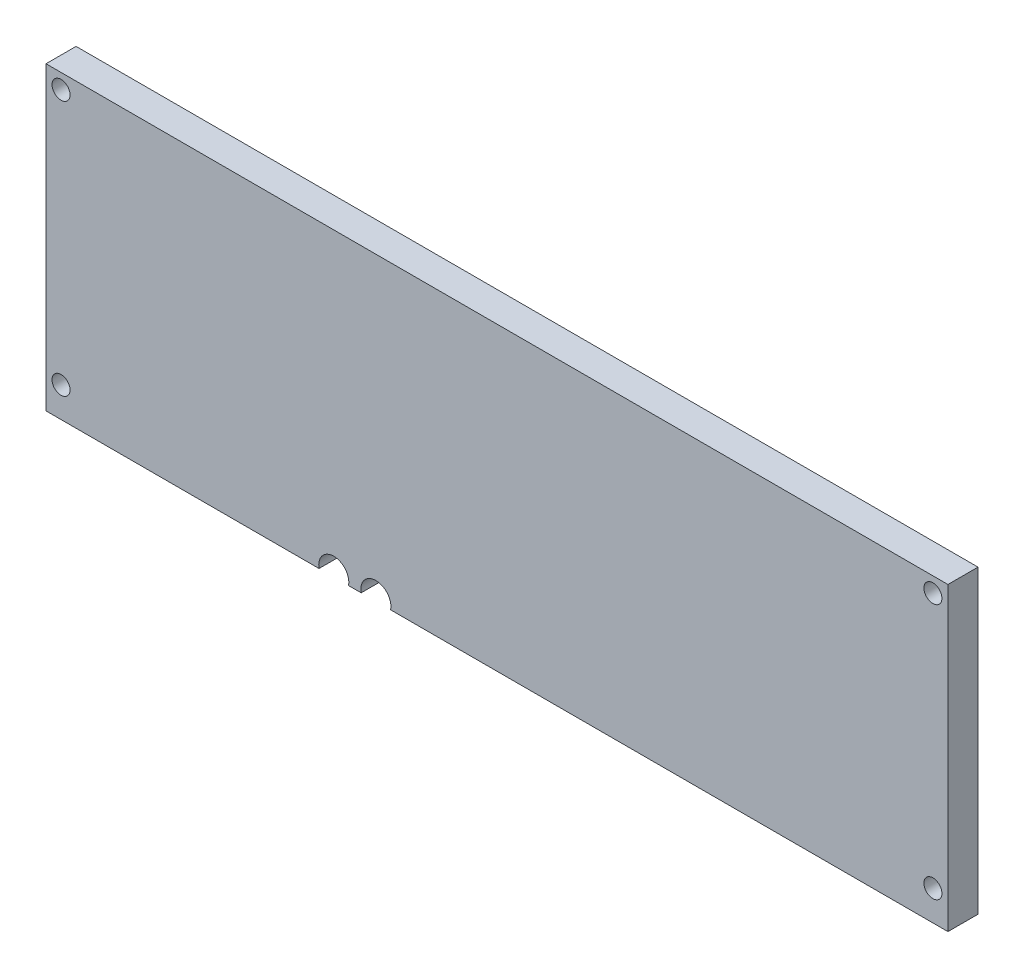
ISO-10303-21;
HEADER;
FILE_DESCRIPTION(('STEP AP214'),'2;1');
FILE_NAME('part.step','',(''),(''),'','','');
FILE_SCHEMA(('AUTOMOTIVE_DESIGN { 1 0 10303 214 1 1 1 1 }'));
ENDSEC;
DATA;
#1=APPLICATION_CONTEXT('core data for automotive mechanical design processes');
#2=APPLICATION_PROTOCOL_DEFINITION('international standard','automotive_design',2000,#1);
#3=PRODUCT_CONTEXT('',#1,'mechanical');
#4=PRODUCT('Part','Part','',(#3));
#5=PRODUCT_RELATED_PRODUCT_CATEGORY('part','',(#4));
#6=PRODUCT_DEFINITION_FORMATION('','',#4);
#7=PRODUCT_DEFINITION_CONTEXT('part definition',#1,'design');
#8=PRODUCT_DEFINITION('design','',#6,#7);
#9=PRODUCT_DEFINITION_SHAPE('','',#8);
#10=(LENGTH_UNIT() NAMED_UNIT(*) SI_UNIT(.MILLI.,.METRE.));
#11=(NAMED_UNIT(*) PLANE_ANGLE_UNIT() SI_UNIT($,.RADIAN.));
#12=(NAMED_UNIT(*) SI_UNIT($,.STERADIAN.) SOLID_ANGLE_UNIT());
#13=UNCERTAINTY_MEASURE_WITH_UNIT(LENGTH_MEASURE(1.E-05),#10,'distance_accuracy_value','');
#14=(GEOMETRIC_REPRESENTATION_CONTEXT(3) GLOBAL_UNCERTAINTY_ASSIGNED_CONTEXT((#13)) GLOBAL_UNIT_ASSIGNED_CONTEXT((#10,
#11,#12)) REPRESENTATION_CONTEXT('',''));
#15=CARTESIAN_POINT('',(0.,0.,0.));
#16=DIRECTION('',(0.,0.,1.));
#17=DIRECTION('',(1.,0.,0.));
#18=AXIS2_PLACEMENT_3D('',#15,#16,#17);
#19=CARTESIAN_POINT('',(0.,0.,5.));
#20=DIRECTION('',(0.,1.,0.));
#21=DIRECTION('',(0.,0.,1.));
#22=AXIS2_PLACEMENT_3D('',#19,#20,#21);
#23=PLANE('',#22);
#24=DIRECTION('',(1.,0.,0.));
#25=VECTOR('',#24,1.);
#26=CARTESIAN_POINT('',(0.,0.,5.));
#27=LINE('',#26,#25);
#28=CARTESIAN_POINT('',(57.310128062905,0.,5.));
#29=VERTEX_POINT('',#28);
#30=CARTESIAN_POINT('',(150.,0.,5.));
#31=VERTEX_POINT('',#30);
#32=EDGE_CURVE('E125',#29,#31,#27,.T.);
#33=ORIENTED_EDGE('',*,*,#32,.F.);
#34=DIRECTION('',(0.,0.,-1.));
#35=VECTOR('',#34,1.);
#36=CARTESIAN_POINT('',(57.310128062905,0.,5.));
#37=LINE('',#36,#35);
#38=CARTESIAN_POINT('',(57.310128062905,0.,0.));
#39=VERTEX_POINT('',#38);
#40=EDGE_CURVE('E223',#29,#39,#37,.T.);
#41=ORIENTED_EDGE('',*,*,#40,.T.);
#42=DIRECTION('',(1.,0.,0.));
#43=VECTOR('',#42,1.);
#44=CARTESIAN_POINT('',(0.,0.,0.));
#45=LINE('',#44,#43);
#46=CARTESIAN_POINT('',(150.,0.,0.));
#47=VERTEX_POINT('',#46);
#48=EDGE_CURVE('E144',#39,#47,#45,.T.);
#49=ORIENTED_EDGE('',*,*,#48,.T.);
#50=DIRECTION('',(0.,0.,-1.));
#51=VECTOR('',#50,1.);
#52=CARTESIAN_POINT('',(150.,0.,5.));
#53=LINE('',#52,#51);
#54=EDGE_CURVE('E164',#31,#47,#53,.T.);
#55=ORIENTED_EDGE('',*,*,#54,.F.);
#56=EDGE_LOOP('',(#33,#41,#49,#55));
#57=FACE_BOUND('',#56,.T.);
#58=ADVANCED_FACE('F39',(#57),#23,.F.);
#59=CARTESIAN_POINT('',(50.3071842271044,0.,0.));
#60=VERTEX_POINT('',#59);
#61=CARTESIAN_POINT('',(52.4111485773386,0.,0.));
#62=VERTEX_POINT('',#61);
#63=EDGE_CURVE('E151',#60,#62,#45,.T.);
#64=ORIENTED_EDGE('',*,*,#63,.T.);
#65=DIRECTION('',(0.,0.,-1.));
#66=VECTOR('',#65,1.);
#67=CARTESIAN_POINT('',(52.4111485773386,0.,5.));
#68=LINE('',#67,#66);
#69=CARTESIAN_POINT('',(52.4111485773386,0.,5.));
#70=VERTEX_POINT('',#69);
#71=EDGE_CURVE('E54',#62,#70,#68,.F.);
#72=ORIENTED_EDGE('',*,*,#71,.T.);
#73=CARTESIAN_POINT('',(50.3071842271044,0.,5.));
#74=VERTEX_POINT('',#73);
#75=EDGE_CURVE('E117',#74,#70,#27,.T.);
#76=ORIENTED_EDGE('',*,*,#75,.F.);
#77=DIRECTION('',(0.,0.,-1.));
#78=VECTOR('',#77,1.);
#79=CARTESIAN_POINT('',(50.3071842271044,0.,5.));
#80=LINE('',#79,#78);
#81=EDGE_CURVE('E102',#74,#60,#80,.T.);
#82=ORIENTED_EDGE('',*,*,#81,.T.);
#83=EDGE_LOOP('',(#64,#72,#76,#82));
#84=FACE_BOUND('',#83,.T.);
#85=ADVANCED_FACE('F123',(#84),#23,.F.);
#86=CARTESIAN_POINT('',(0.,0.,5.));
#87=DIRECTION('',(1.,0.,0.));
#88=DIRECTION('',(0.,0.,-1.));
#89=AXIS2_PLACEMENT_3D('',#86,#87,#88);
#90=PLANE('',#89);
#91=DIRECTION('',(0.,-1.,0.));
#92=VECTOR('',#91,1.);
#93=CARTESIAN_POINT('',(0.,0.,0.));
#94=LINE('',#93,#92);
#95=CARTESIAN_POINT('',(0.,50.,0.));
#96=VERTEX_POINT('',#95);
#97=CARTESIAN_POINT('',(0.,0.,0.));
#98=VERTEX_POINT('',#97);
#99=EDGE_CURVE('E140',#96,#98,#94,.T.);
#100=ORIENTED_EDGE('',*,*,#99,.T.);
#101=DIRECTION('',(0.,0.,-1.));
#102=VECTOR('',#101,1.);
#103=CARTESIAN_POINT('',(0.,0.,5.));
#104=LINE('',#103,#102);
#105=CARTESIAN_POINT('',(0.,0.,5.));
#106=VERTEX_POINT('',#105);
#107=EDGE_CURVE('E168',#106,#98,#104,.T.);
#108=ORIENTED_EDGE('',*,*,#107,.F.);
#109=DIRECTION('',(0.,-1.,0.));
#110=VECTOR('',#109,1.);
#111=CARTESIAN_POINT('',(0.,0.,5.));
#112=LINE('',#111,#110);
#113=CARTESIAN_POINT('',(0.,50.,5.));
#114=VERTEX_POINT('',#113);
#115=EDGE_CURVE('E130',#114,#106,#112,.T.);
#116=ORIENTED_EDGE('',*,*,#115,.F.);
#117=DIRECTION('',(0.,0.,-1.));
#118=VECTOR('',#117,1.);
#119=CARTESIAN_POINT('',(0.,50.,5.));
#120=LINE('',#119,#118);
#121=EDGE_CURVE('E139',#114,#96,#120,.T.);
#122=ORIENTED_EDGE('',*,*,#121,.T.);
#123=EDGE_LOOP('',(#100,#108,#116,#122));
#124=FACE_BOUND('',#123,.T.);
#125=ADVANCED_FACE('F41',(#124),#90,.F.);
#126=CARTESIAN_POINT('',(45.408204741538,0.,0.));
#127=VERTEX_POINT('',#126);
#128=EDGE_CURVE('E146',#98,#127,#45,.T.);
#129=ORIENTED_EDGE('',*,*,#128,.T.);
#130=DIRECTION('',(0.,0.,-1.));
#131=VECTOR('',#130,1.);
#132=CARTESIAN_POINT('',(45.408204741538,0.,5.));
#133=LINE('',#132,#131);
#134=CARTESIAN_POINT('',(45.408204741538,0.,5.));
#135=VERTEX_POINT('',#134);
#136=EDGE_CURVE('E62',#127,#135,#133,.F.);
#137=ORIENTED_EDGE('',*,*,#136,.T.);
#138=EDGE_CURVE('E119',#106,#135,#27,.T.);
#139=ORIENTED_EDGE('',*,*,#138,.F.);
#140=ORIENTED_EDGE('',*,*,#107,.T.);
#141=EDGE_LOOP('',(#129,#137,#139,#140));
#142=FACE_BOUND('',#141,.T.);
#143=ADVANCED_FACE('F264',(#142),#23,.F.);
#144=CARTESIAN_POINT('',(150.,0.,5.));
#145=DIRECTION('',(-1.,0.,0.));
#146=DIRECTION('',(0.,0.,1.));
#147=AXIS2_PLACEMENT_3D('',#144,#145,#146);
#148=PLANE('',#147);
#149=DIRECTION('',(0.,1.,0.));
#150=VECTOR('',#149,1.);
#151=CARTESIAN_POINT('',(150.,0.,0.));
#152=LINE('',#151,#150);
#153=CARTESIAN_POINT('',(150.,50.,0.));
#154=VERTEX_POINT('',#153);
#155=EDGE_CURVE('E150',#47,#154,#152,.T.);
#156=ORIENTED_EDGE('',*,*,#155,.T.);
#157=DIRECTION('',(0.,0.,-1.));
#158=VECTOR('',#157,1.);
#159=CARTESIAN_POINT('',(150.,50.,5.));
#160=LINE('',#159,#158);
#161=CARTESIAN_POINT('',(150.,50.,5.));
#162=VERTEX_POINT('',#161);
#163=EDGE_CURVE('E160',#162,#154,#160,.T.);
#164=ORIENTED_EDGE('',*,*,#163,.F.);
#165=DIRECTION('',(0.,1.,0.));
#166=VECTOR('',#165,1.);
#167=CARTESIAN_POINT('',(150.,0.,5.));
#168=LINE('',#167,#166);
#169=EDGE_CURVE('E129',#31,#162,#168,.T.);
#170=ORIENTED_EDGE('',*,*,#169,.F.);
#171=ORIENTED_EDGE('',*,*,#54,.T.);
#172=EDGE_LOOP('',(#156,#164,#170,#171));
#173=FACE_BOUND('',#172,.T.);
#174=ADVANCED_FACE('F243',(#173),#148,.F.);
#175=CARTESIAN_POINT('',(0.,50.,5.));
#176=DIRECTION('',(0.,-1.,0.));
#177=DIRECTION('',(0.,0.,-1.));
#178=AXIS2_PLACEMENT_3D('',#175,#176,#177);
#179=PLANE('',#178);
#180=DIRECTION('',(-1.,0.,0.));
#181=VECTOR('',#180,1.);
#182=CARTESIAN_POINT('',(0.,50.,0.));
#183=LINE('',#182,#181);
#184=EDGE_CURVE('E154',#154,#96,#183,.T.);
#185=ORIENTED_EDGE('',*,*,#184,.T.);
#186=ORIENTED_EDGE('',*,*,#121,.F.);
#187=DIRECTION('',(-1.,0.,0.));
#188=VECTOR('',#187,1.);
#189=CARTESIAN_POINT('',(0.,50.,5.));
#190=LINE('',#189,#188);
#191=EDGE_CURVE('E136',#162,#114,#190,.T.);
#192=ORIENTED_EDGE('',*,*,#191,.F.);
#193=ORIENTED_EDGE('',*,*,#163,.T.);
#194=EDGE_LOOP('',(#185,#186,#192,#193));
#195=FACE_BOUND('',#194,.T.);
#196=ADVANCED_FACE('F249',(#195),#179,.F.);
#197=CARTESIAN_POINT('',(0.,0.,5.));
#198=DIRECTION('',(0.,0.,-1.));
#199=DIRECTION('',(-1.,0.,0.));
#200=AXIS2_PLACEMENT_3D('',#197,#198,#199);
#201=PLANE('',#200);
#202=CARTESIAN_POINT('',(147.5,5.,5.));
#203=DIRECTION('',(0.,0.,1.));
#204=DIRECTION('',(1.,0.,0.));
#205=AXIS2_PLACEMENT_3D('',#202,#203,#204);
#206=CIRCLE('',#205,1.5);
#207=CARTESIAN_POINT('',(149.,5.,5.));
#208=VERTEX_POINT('',#207);
#209=EDGE_CURVE('E219',#208,#208,#206,.T.);
#210=ORIENTED_EDGE('',*,*,#209,.F.);
#211=EDGE_LOOP('',(#210));
#212=FACE_BOUND('',#211,.T.);
#213=CARTESIAN_POINT('',(147.5,47.5,5.));
#214=DIRECTION('',(0.,0.,1.));
#215=DIRECTION('',(1.,0.,0.));
#216=AXIS2_PLACEMENT_3D('',#213,#214,#215);
#217=CIRCLE('',#216,1.5);
#218=CARTESIAN_POINT('',(149.,47.5,5.));
#219=VERTEX_POINT('',#218);
#220=EDGE_CURVE('E216',#219,#219,#217,.T.);
#221=ORIENTED_EDGE('',*,*,#220,.F.);
#222=EDGE_LOOP('',(#221));
#223=FACE_BOUND('',#222,.T.);
#224=CARTESIAN_POINT('',(2.5,47.5,5.));
#225=DIRECTION('',(0.,0.,1.));
#226=DIRECTION('',(1.,0.,0.));
#227=AXIS2_PLACEMENT_3D('',#224,#225,#226);
#228=CIRCLE('',#227,1.5);
#229=CARTESIAN_POINT('',(4.,47.5,5.));
#230=VERTEX_POINT('',#229);
#231=EDGE_CURVE('E213',#230,#230,#228,.T.);
#232=ORIENTED_EDGE('',*,*,#231,.F.);
#233=EDGE_LOOP('',(#232));
#234=FACE_BOUND('',#233,.T.);
#235=CARTESIAN_POINT('',(2.5,5.,5.));
#236=DIRECTION('',(0.,0.,1.));
#237=DIRECTION('',(1.,0.,0.));
#238=AXIS2_PLACEMENT_3D('',#235,#236,#237);
#239=CIRCLE('',#238,1.5);
#240=CARTESIAN_POINT('',(4.,5.,5.));
#241=VERTEX_POINT('',#240);
#242=EDGE_CURVE('E177',#241,#241,#239,.T.);
#243=ORIENTED_EDGE('',*,*,#242,.F.);
#244=EDGE_LOOP('',(#243));
#245=FACE_BOUND('',#244,.T.);
#246=ORIENTED_EDGE('',*,*,#75,.T.);
#247=CARTESIAN_POINT('',(54.8606383201218,0.5,5.));
#248=DIRECTION('',(0.,0.,-1.));
#249=DIRECTION('',(-1.,0.,0.));
#250=AXIS2_PLACEMENT_3D('',#247,#248,#249);
#251=CIRCLE('',#250,2.5);
#252=EDGE_CURVE('E121',#70,#29,#251,.T.);
#253=ORIENTED_EDGE('',*,*,#252,.T.);
#254=ORIENTED_EDGE('',*,*,#32,.T.);
#255=ORIENTED_EDGE('',*,*,#169,.T.);
#256=ORIENTED_EDGE('',*,*,#191,.T.);
#257=ORIENTED_EDGE('',*,*,#115,.T.);
#258=ORIENTED_EDGE('',*,*,#138,.T.);
#259=CARTESIAN_POINT('',(47.8576944843212,0.5,5.));
#260=DIRECTION('',(0.,0.,-1.));
#261=DIRECTION('',(-1.,0.,0.));
#262=AXIS2_PLACEMENT_3D('',#259,#260,#261);
#263=CIRCLE('',#262,2.5);
#264=EDGE_CURVE('E105',#135,#74,#263,.T.);
#265=ORIENTED_EDGE('',*,*,#264,.T.);
#266=EDGE_LOOP('',(#246,#253,#254,#255,#256,#257,#258,#265));
#267=FACE_BOUND('',#266,.T.);
#268=ADVANCED_FACE('F115',(#212,#223,#234,#245,#267),#201,.F.);
#269=CARTESIAN_POINT('',(0.,0.,0.));
#270=DIRECTION('',(0.,0.,-1.));
#271=DIRECTION('',(-1.,0.,0.));
#272=AXIS2_PLACEMENT_3D('',#269,#270,#271);
#273=PLANE('',#272);
#274=CARTESIAN_POINT('',(54.8606383201218,0.5,0.));
#275=DIRECTION('',(0.,0.,-1.));
#276=DIRECTION('',(-1.,0.,0.));
#277=AXIS2_PLACEMENT_3D('',#274,#275,#276);
#278=CIRCLE('',#277,2.5);
#279=EDGE_CURVE('E11',#62,#39,#278,.T.);
#280=ORIENTED_EDGE('',*,*,#279,.F.);
#281=ORIENTED_EDGE('',*,*,#63,.F.);
#282=CARTESIAN_POINT('',(47.8576944843212,0.5,0.));
#283=DIRECTION('',(0.,0.,-1.));
#284=DIRECTION('',(-1.,0.,0.));
#285=AXIS2_PLACEMENT_3D('',#282,#283,#284);
#286=CIRCLE('',#285,2.5);
#287=EDGE_CURVE('E48',#127,#60,#286,.T.);
#288=ORIENTED_EDGE('',*,*,#287,.F.);
#289=ORIENTED_EDGE('',*,*,#128,.F.);
#290=ORIENTED_EDGE('',*,*,#99,.F.);
#291=ORIENTED_EDGE('',*,*,#184,.F.);
#292=ORIENTED_EDGE('',*,*,#155,.F.);
#293=ORIENTED_EDGE('',*,*,#48,.F.);
#294=EDGE_LOOP('',(#280,#281,#288,#289,#290,#291,#292,#293));
#295=FACE_BOUND('',#294,.T.);
#296=CARTESIAN_POINT('',(147.5,5.,0.));
#297=DIRECTION('',(0.,0.,-1.));
#298=DIRECTION('',(-1.,0.,0.));
#299=AXIS2_PLACEMENT_3D('',#296,#297,#298);
#300=CIRCLE('',#299,1.5);
#301=CARTESIAN_POINT('',(146.,5.,0.));
#302=VERTEX_POINT('',#301);
#303=EDGE_CURVE('E145',#302,#302,#300,.T.);
#304=ORIENTED_EDGE('',*,*,#303,.F.);
#305=EDGE_LOOP('',(#304));
#306=FACE_BOUND('',#305,.T.);
#307=CARTESIAN_POINT('',(147.5,47.5,0.));
#308=DIRECTION('',(0.,0.,-1.));
#309=DIRECTION('',(-1.,0.,0.));
#310=AXIS2_PLACEMENT_3D('',#307,#308,#309);
#311=CIRCLE('',#310,1.5);
#312=CARTESIAN_POINT('',(146.,47.5,0.));
#313=VERTEX_POINT('',#312);
#314=EDGE_CURVE('E181',#313,#313,#311,.T.);
#315=ORIENTED_EDGE('',*,*,#314,.F.);
#316=EDGE_LOOP('',(#315));
#317=FACE_BOUND('',#316,.T.);
#318=CARTESIAN_POINT('',(2.5,47.5,0.));
#319=DIRECTION('',(0.,0.,-1.));
#320=DIRECTION('',(-1.,0.,0.));
#321=AXIS2_PLACEMENT_3D('',#318,#319,#320);
#322=CIRCLE('',#321,1.5);
#323=CARTESIAN_POINT('',(1.,47.5,0.));
#324=VERTEX_POINT('',#323);
#325=EDGE_CURVE('E176',#324,#324,#322,.T.);
#326=ORIENTED_EDGE('',*,*,#325,.F.);
#327=EDGE_LOOP('',(#326));
#328=FACE_BOUND('',#327,.T.);
#329=CARTESIAN_POINT('',(2.5,5.,0.));
#330=DIRECTION('',(0.,0.,-1.));
#331=DIRECTION('',(-1.,0.,0.));
#332=AXIS2_PLACEMENT_3D('',#329,#330,#331);
#333=CIRCLE('',#332,1.5);
#334=CARTESIAN_POINT('',(1.,5.,0.));
#335=VERTEX_POINT('',#334);
#336=EDGE_CURVE('E172',#335,#335,#333,.T.);
#337=ORIENTED_EDGE('',*,*,#336,.F.);
#338=EDGE_LOOP('',(#337));
#339=FACE_BOUND('',#338,.T.);
#340=ADVANCED_FACE('F193',(#295,#306,#317,#328,#339),#273,.T.);
#341=CARTESIAN_POINT('',(2.5,5.,-5.));
#342=DIRECTION('',(0.,0.,1.));
#343=DIRECTION('',(1.,0.,0.));
#344=AXIS2_PLACEMENT_3D('',#341,#342,#343);
#345=CYLINDRICAL_SURFACE('',#344,1.5);
#346=ORIENTED_EDGE('',*,*,#336,.T.);
#347=EDGE_LOOP('',(#346));
#348=FACE_BOUND('',#347,.T.);
#349=ORIENTED_EDGE('',*,*,#242,.T.);
#350=EDGE_LOOP('',(#349));
#351=FACE_BOUND('',#350,.T.);
#352=ADVANCED_FACE('F196',(#348,#351),#345,.F.);
#353=CARTESIAN_POINT('',(2.5,47.5,-5.));
#354=DIRECTION('',(0.,0.,1.));
#355=DIRECTION('',(1.,0.,0.));
#356=AXIS2_PLACEMENT_3D('',#353,#354,#355);
#357=CYLINDRICAL_SURFACE('',#356,1.5);
#358=ORIENTED_EDGE('',*,*,#325,.T.);
#359=EDGE_LOOP('',(#358));
#360=FACE_BOUND('',#359,.T.);
#361=ORIENTED_EDGE('',*,*,#231,.T.);
#362=EDGE_LOOP('',(#361));
#363=FACE_BOUND('',#362,.T.);
#364=ADVANCED_FACE('F207',(#360,#363),#357,.F.);
#365=CARTESIAN_POINT('',(147.5,47.5,-5.));
#366=DIRECTION('',(0.,0.,1.));
#367=DIRECTION('',(1.,0.,0.));
#368=AXIS2_PLACEMENT_3D('',#365,#366,#367);
#369=CYLINDRICAL_SURFACE('',#368,1.5);
#370=ORIENTED_EDGE('',*,*,#314,.T.);
#371=EDGE_LOOP('',(#370));
#372=FACE_BOUND('',#371,.T.);
#373=ORIENTED_EDGE('',*,*,#220,.T.);
#374=EDGE_LOOP('',(#373));
#375=FACE_BOUND('',#374,.T.);
#376=ADVANCED_FACE('F326',(#372,#375),#369,.F.);
#377=CARTESIAN_POINT('',(147.5,5.,-5.));
#378=DIRECTION('',(0.,0.,1.));
#379=DIRECTION('',(1.,0.,0.));
#380=AXIS2_PLACEMENT_3D('',#377,#378,#379);
#381=CYLINDRICAL_SURFACE('',#380,1.5);
#382=ORIENTED_EDGE('',*,*,#303,.T.);
#383=EDGE_LOOP('',(#382));
#384=FACE_BOUND('',#383,.T.);
#385=ORIENTED_EDGE('',*,*,#209,.T.);
#386=EDGE_LOOP('',(#385));
#387=FACE_BOUND('',#386,.T.);
#388=ADVANCED_FACE('F190',(#384,#387),#381,.F.);
#389=CARTESIAN_POINT('',(47.8576944843212,0.5,5.));
#390=DIRECTION('',(0.,0.,-1.));
#391=DIRECTION('',(-1.,0.,0.));
#392=AXIS2_PLACEMENT_3D('',#389,#390,#391);
#393=CYLINDRICAL_SURFACE('',#392,2.5);
#394=ORIENTED_EDGE('',*,*,#264,.F.);
#395=ORIENTED_EDGE('',*,*,#136,.F.);
#396=ORIENTED_EDGE('',*,*,#287,.T.);
#397=ORIENTED_EDGE('',*,*,#81,.F.);
#398=EDGE_LOOP('',(#394,#395,#396,#397));
#399=FACE_BOUND('',#398,.T.);
#400=ADVANCED_FACE('F104',(#399),#393,.F.);
#401=CARTESIAN_POINT('',(54.8606383201218,0.5,5.));
#402=DIRECTION('',(0.,0.,-1.));
#403=DIRECTION('',(-1.,0.,0.));
#404=AXIS2_PLACEMENT_3D('',#401,#402,#403);
#405=CYLINDRICAL_SURFACE('',#404,2.5);
#406=ORIENTED_EDGE('',*,*,#252,.F.);
#407=ORIENTED_EDGE('',*,*,#71,.F.);
#408=ORIENTED_EDGE('',*,*,#279,.T.);
#409=ORIENTED_EDGE('',*,*,#40,.F.);
#410=EDGE_LOOP('',(#406,#407,#408,#409));
#411=FACE_BOUND('',#410,.T.);
#412=ADVANCED_FACE('F256',(#411),#405,.F.);
#413=CLOSED_SHELL('',(#58,#85,#125,#143,#174,#196,#268,#340,#352,#364,#376,#388,#400,#412));
#414=MANIFOLD_SOLID_BREP('B2',#413);
#415=ADVANCED_BREP_SHAPE_REPRESENTATION('',(#18,#414),#14);
#416=SHAPE_DEFINITION_REPRESENTATION(#9,#415);
ENDSEC;
END-ISO-10303-21;
